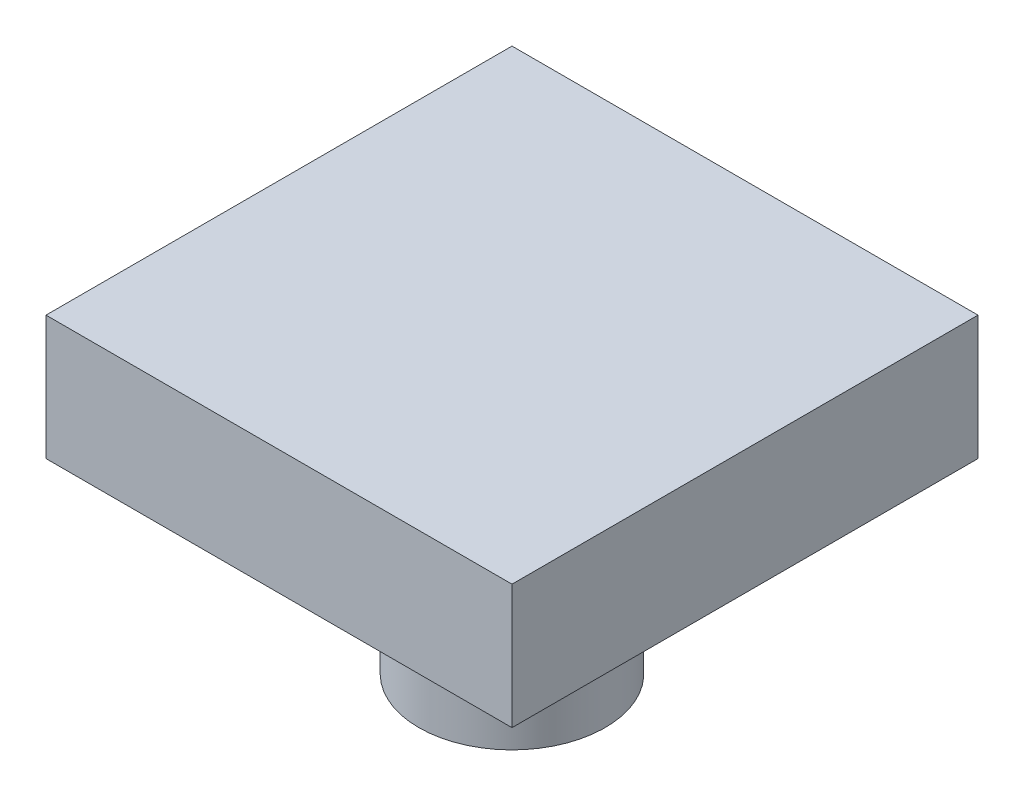
ISO-10303-21;
HEADER;
FILE_DESCRIPTION(('STEP AP214'),'2;1');
FILE_NAME('part.step','',(''),(''),'','','');
FILE_SCHEMA(('AUTOMOTIVE_DESIGN { 1 0 10303 214 1 1 1 1 }'));
ENDSEC;
DATA;
#1=APPLICATION_CONTEXT('core data for automotive mechanical design processes');
#2=APPLICATION_PROTOCOL_DEFINITION('international standard','automotive_design',2000,#1);
#3=PRODUCT_CONTEXT('',#1,'mechanical');
#4=PRODUCT('Part','Part','',(#3));
#5=PRODUCT_RELATED_PRODUCT_CATEGORY('part','',(#4));
#6=PRODUCT_DEFINITION_FORMATION('','',#4);
#7=PRODUCT_DEFINITION_CONTEXT('part definition',#1,'design');
#8=PRODUCT_DEFINITION('design','',#6,#7);
#9=PRODUCT_DEFINITION_SHAPE('','',#8);
#10=(LENGTH_UNIT() NAMED_UNIT(*) SI_UNIT(.MILLI.,.METRE.));
#11=(NAMED_UNIT(*) PLANE_ANGLE_UNIT() SI_UNIT($,.RADIAN.));
#12=(NAMED_UNIT(*) SI_UNIT($,.STERADIAN.) SOLID_ANGLE_UNIT());
#13=UNCERTAINTY_MEASURE_WITH_UNIT(LENGTH_MEASURE(1.E-05),#10,'distance_accuracy_value','');
#14=(GEOMETRIC_REPRESENTATION_CONTEXT(3) GLOBAL_UNCERTAINTY_ASSIGNED_CONTEXT((#13)) GLOBAL_UNIT_ASSIGNED_CONTEXT((#10,
#11,#12)) REPRESENTATION_CONTEXT('',''));
#15=CARTESIAN_POINT('',(0.,0.,0.));
#16=DIRECTION('',(0.,0.,1.));
#17=DIRECTION('',(1.,0.,0.));
#18=AXIS2_PLACEMENT_3D('',#15,#16,#17);
#19=CARTESIAN_POINT('',(-15.,8.,-15.));
#20=DIRECTION('',(1.,0.,0.));
#21=DIRECTION('',(0.,0.,-1.));
#22=AXIS2_PLACEMENT_3D('',#19,#20,#21);
#23=PLANE('',#22);
#24=DIRECTION('',(0.,0.,1.));
#25=VECTOR('',#24,1.);
#26=CARTESIAN_POINT('',(-15.,0.,-15.));
#27=LINE('',#26,#25);
#28=CARTESIAN_POINT('',(-15.,0.,-15.));
#29=VERTEX_POINT('',#28);
#30=CARTESIAN_POINT('',(-15.,0.,15.));
#31=VERTEX_POINT('',#30);
#32=EDGE_CURVE('E105',#29,#31,#27,.T.);
#33=ORIENTED_EDGE('',*,*,#32,.T.);
#34=DIRECTION('',(0.,-1.,0.));
#35=VECTOR('',#34,1.);
#36=CARTESIAN_POINT('',(-15.,8.,15.));
#37=LINE('',#36,#35);
#38=CARTESIAN_POINT('',(-15.,8.,15.));
#39=VERTEX_POINT('',#38);
#40=EDGE_CURVE('E11',#39,#31,#37,.T.);
#41=ORIENTED_EDGE('',*,*,#40,.F.);
#42=DIRECTION('',(0.,0.,1.));
#43=VECTOR('',#42,1.);
#44=CARTESIAN_POINT('',(-15.,8.,-15.));
#45=LINE('',#44,#43);
#46=CARTESIAN_POINT('',(-15.,8.,-15.));
#47=VERTEX_POINT('',#46);
#48=EDGE_CURVE('E89',#47,#39,#45,.T.);
#49=ORIENTED_EDGE('',*,*,#48,.F.);
#50=DIRECTION('',(0.,-1.,0.));
#51=VECTOR('',#50,1.);
#52=CARTESIAN_POINT('',(-15.,8.,-15.));
#53=LINE('',#52,#51);
#54=EDGE_CURVE('E97',#47,#29,#53,.T.);
#55=ORIENTED_EDGE('',*,*,#54,.T.);
#56=EDGE_LOOP('',(#33,#41,#49,#55));
#57=FACE_BOUND('',#56,.T.);
#58=ADVANCED_FACE('F39',(#57),#23,.F.);
#59=CARTESIAN_POINT('',(-15.,8.,15.));
#60=DIRECTION('',(0.,0.,-1.));
#61=DIRECTION('',(-1.,0.,0.));
#62=AXIS2_PLACEMENT_3D('',#59,#60,#61);
#63=PLANE('',#62);
#64=DIRECTION('',(1.,0.,0.));
#65=VECTOR('',#64,1.);
#66=CARTESIAN_POINT('',(-15.,0.,15.));
#67=LINE('',#66,#65);
#68=CARTESIAN_POINT('',(15.,0.,15.));
#69=VERTEX_POINT('',#68);
#70=EDGE_CURVE('E92',#31,#69,#67,.T.);
#71=ORIENTED_EDGE('',*,*,#70,.T.);
#72=DIRECTION('',(0.,-1.,0.));
#73=VECTOR('',#72,1.);
#74=CARTESIAN_POINT('',(15.,8.,15.));
#75=LINE('',#74,#73);
#76=CARTESIAN_POINT('',(15.,8.,15.));
#77=VERTEX_POINT('',#76);
#78=EDGE_CURVE('E50',#77,#69,#75,.T.);
#79=ORIENTED_EDGE('',*,*,#78,.F.);
#80=DIRECTION('',(1.,0.,0.));
#81=VECTOR('',#80,1.);
#82=CARTESIAN_POINT('',(-15.,8.,15.));
#83=LINE('',#82,#81);
#84=EDGE_CURVE('E82',#39,#77,#83,.T.);
#85=ORIENTED_EDGE('',*,*,#84,.F.);
#86=ORIENTED_EDGE('',*,*,#40,.T.);
#87=EDGE_LOOP('',(#71,#79,#85,#86));
#88=FACE_BOUND('',#87,.T.);
#89=ADVANCED_FACE('F93',(#88),#63,.F.);
#90=CARTESIAN_POINT('',(15.,8.,15.));
#91=DIRECTION('',(-1.,0.,0.));
#92=DIRECTION('',(0.,0.,1.));
#93=AXIS2_PLACEMENT_3D('',#90,#91,#92);
#94=PLANE('',#93);
#95=DIRECTION('',(0.,0.,-1.));
#96=VECTOR('',#95,1.);
#97=CARTESIAN_POINT('',(15.,0.,15.));
#98=LINE('',#97,#96);
#99=CARTESIAN_POINT('',(15.,0.,-15.));
#100=VERTEX_POINT('',#99);
#101=EDGE_CURVE('E75',#69,#100,#98,.T.);
#102=ORIENTED_EDGE('',*,*,#101,.T.);
#103=DIRECTION('',(0.,-1.,0.));
#104=VECTOR('',#103,1.);
#105=CARTESIAN_POINT('',(15.,8.,-15.));
#106=LINE('',#105,#104);
#107=CARTESIAN_POINT('',(15.,8.,-15.));
#108=VERTEX_POINT('',#107);
#109=EDGE_CURVE('E94',#108,#100,#106,.T.);
#110=ORIENTED_EDGE('',*,*,#109,.F.);
#111=DIRECTION('',(0.,0.,-1.));
#112=VECTOR('',#111,1.);
#113=CARTESIAN_POINT('',(15.,8.,15.));
#114=LINE('',#113,#112);
#115=EDGE_CURVE('E88',#77,#108,#114,.T.);
#116=ORIENTED_EDGE('',*,*,#115,.F.);
#117=ORIENTED_EDGE('',*,*,#78,.T.);
#118=EDGE_LOOP('',(#102,#110,#116,#117));
#119=FACE_BOUND('',#118,.T.);
#120=ADVANCED_FACE('F96',(#119),#94,.F.);
#121=CARTESIAN_POINT('',(15.,8.,-15.));
#122=DIRECTION('',(0.,0.,1.));
#123=DIRECTION('',(1.,0.,0.));
#124=AXIS2_PLACEMENT_3D('',#121,#122,#123);
#125=PLANE('',#124);
#126=DIRECTION('',(-1.,0.,0.));
#127=VECTOR('',#126,1.);
#128=CARTESIAN_POINT('',(15.,0.,-15.));
#129=LINE('',#128,#127);
#130=EDGE_CURVE('E76',#100,#29,#129,.T.);
#131=ORIENTED_EDGE('',*,*,#130,.T.);
#132=ORIENTED_EDGE('',*,*,#54,.F.);
#133=DIRECTION('',(-1.,0.,0.));
#134=VECTOR('',#133,1.);
#135=CARTESIAN_POINT('',(15.,8.,-15.));
#136=LINE('',#135,#134);
#137=EDGE_CURVE('E54',#108,#47,#136,.T.);
#138=ORIENTED_EDGE('',*,*,#137,.F.);
#139=ORIENTED_EDGE('',*,*,#109,.T.);
#140=EDGE_LOOP('',(#131,#132,#138,#139));
#141=FACE_BOUND('',#140,.T.);
#142=ADVANCED_FACE('F109',(#141),#125,.F.);
#143=CARTESIAN_POINT('',(0.,8.,0.));
#144=DIRECTION('',(0.,1.,0.));
#145=DIRECTION('',(0.,0.,1.));
#146=AXIS2_PLACEMENT_3D('',#143,#144,#145);
#147=PLANE('',#146);
#148=ORIENTED_EDGE('',*,*,#48,.T.);
#149=ORIENTED_EDGE('',*,*,#84,.T.);
#150=ORIENTED_EDGE('',*,*,#115,.T.);
#151=ORIENTED_EDGE('',*,*,#137,.T.);
#152=EDGE_LOOP('',(#148,#149,#150,#151));
#153=FACE_BOUND('',#152,.T.);
#154=ADVANCED_FACE('F86',(#153),#147,.T.);
#155=CARTESIAN_POINT('',(0.,0.,0.));
#156=DIRECTION('',(0.,1.,0.));
#157=DIRECTION('',(0.,0.,1.));
#158=AXIS2_PLACEMENT_3D('',#155,#156,#157);
#159=PLANE('',#158);
#160=CARTESIAN_POINT('',(0.,0.,0.));
#161=DIRECTION('',(0.,1.,0.));
#162=DIRECTION('',(0.,0.,1.));
#163=AXIS2_PLACEMENT_3D('',#160,#161,#162);
#164=CIRCLE('',#163,6.);
#165=CARTESIAN_POINT('',(0.,0.,6.));
#166=VERTEX_POINT('',#165);
#167=EDGE_CURVE('E118',#166,#166,#164,.T.);
#168=ORIENTED_EDGE('',*,*,#167,.T.);
#169=EDGE_LOOP('',(#168));
#170=FACE_BOUND('',#169,.T.);
#171=ORIENTED_EDGE('',*,*,#32,.F.);
#172=ORIENTED_EDGE('',*,*,#130,.F.);
#173=ORIENTED_EDGE('',*,*,#101,.F.);
#174=ORIENTED_EDGE('',*,*,#70,.F.);
#175=EDGE_LOOP('',(#171,#172,#173,#174));
#176=FACE_BOUND('',#175,.T.);
#177=ADVANCED_FACE('F111',(#170,#176),#159,.F.);
#178=CARTESIAN_POINT('',(0.,-12.,0.));
#179=DIRECTION('',(0.,1.,0.));
#180=DIRECTION('',(0.,0.,1.));
#181=AXIS2_PLACEMENT_3D('',#178,#179,#180);
#182=CYLINDRICAL_SURFACE('',#181,6.);
#183=CARTESIAN_POINT('',(0.,-12.,0.));
#184=DIRECTION('',(0.,1.,0.));
#185=DIRECTION('',(0.,0.,1.));
#186=AXIS2_PLACEMENT_3D('',#183,#184,#185);
#187=CIRCLE('',#186,6.);
#188=CARTESIAN_POINT('',(0.,-12.,6.));
#189=VERTEX_POINT('',#188);
#190=EDGE_CURVE('E103',#189,#189,#187,.T.);
#191=ORIENTED_EDGE('',*,*,#190,.T.);
#192=EDGE_LOOP('',(#191));
#193=FACE_BOUND('',#192,.T.);
#194=ORIENTED_EDGE('',*,*,#167,.F.);
#195=EDGE_LOOP('',(#194));
#196=FACE_BOUND('',#195,.T.);
#197=ADVANCED_FACE('F122',(#193,#196),#182,.T.);
#198=CARTESIAN_POINT('',(0.,-12.,0.));
#199=DIRECTION('',(0.,1.,0.));
#200=DIRECTION('',(0.,0.,1.));
#201=AXIS2_PLACEMENT_3D('',#198,#199,#200);
#202=PLANE('',#201);
#203=ORIENTED_EDGE('',*,*,#190,.F.);
#204=EDGE_LOOP('',(#203));
#205=FACE_BOUND('',#204,.T.);
#206=ADVANCED_FACE('F124',(#205),#202,.F.);
#207=CLOSED_SHELL('',(#58,#89,#120,#142,#154,#177,#197,#206));
#208=MANIFOLD_SOLID_BREP('B2',#207);
#209=ADVANCED_BREP_SHAPE_REPRESENTATION('',(#18,#208),#14);
#210=SHAPE_DEFINITION_REPRESENTATION(#9,#209);
ENDSEC;
END-ISO-10303-21;
